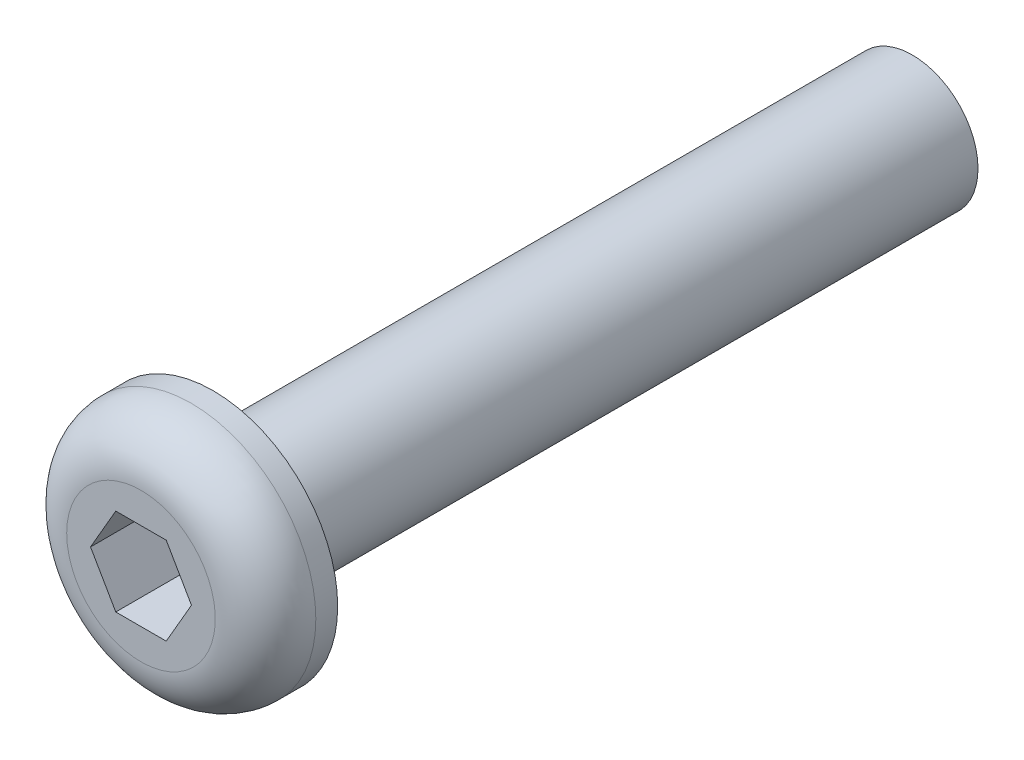
ISO-10303-21;
HEADER;
FILE_DESCRIPTION(('STEP AP214'),'2;1');
FILE_NAME('part.step','',(''),(''),'','','');
FILE_SCHEMA(('AUTOMOTIVE_DESIGN { 1 0 10303 214 1 1 1 1 }'));
ENDSEC;
DATA;
#1=APPLICATION_CONTEXT('core data for automotive mechanical design processes');
#2=APPLICATION_PROTOCOL_DEFINITION('international standard','automotive_design',2000,#1);
#3=PRODUCT_CONTEXT('',#1,'mechanical');
#4=PRODUCT('Part','Part','',(#3));
#5=PRODUCT_RELATED_PRODUCT_CATEGORY('part','',(#4));
#6=PRODUCT_DEFINITION_FORMATION('','',#4);
#7=PRODUCT_DEFINITION_CONTEXT('part definition',#1,'design');
#8=PRODUCT_DEFINITION('design','',#6,#7);
#9=PRODUCT_DEFINITION_SHAPE('','',#8);
#10=(LENGTH_UNIT() NAMED_UNIT(*) SI_UNIT(.MILLI.,.METRE.));
#11=(NAMED_UNIT(*) PLANE_ANGLE_UNIT() SI_UNIT($,.RADIAN.));
#12=(NAMED_UNIT(*) SI_UNIT($,.STERADIAN.) SOLID_ANGLE_UNIT());
#13=UNCERTAINTY_MEASURE_WITH_UNIT(LENGTH_MEASURE(1.E-05),#10,'distance_accuracy_value','');
#14=(GEOMETRIC_REPRESENTATION_CONTEXT(3) GLOBAL_UNCERTAINTY_ASSIGNED_CONTEXT((#13)) GLOBAL_UNIT_ASSIGNED_CONTEXT((#10,
#11,#12)) REPRESENTATION_CONTEXT('',''));
#15=CARTESIAN_POINT('',(0.,0.,0.));
#16=DIRECTION('',(0.,0.,1.));
#17=DIRECTION('',(1.,0.,0.));
#18=AXIS2_PLACEMENT_3D('',#15,#16,#17);
#19=CARTESIAN_POINT('',(0.,0.,-16.));
#20=DIRECTION('',(0.,0.,1.));
#21=DIRECTION('',(1.,0.,0.));
#22=AXIS2_PLACEMENT_3D('',#19,#20,#21);
#23=CYLINDRICAL_SURFACE('',#22,1.5);
#24=CARTESIAN_POINT('',(0.,0.,-16.));
#25=DIRECTION('',(0.,0.,1.));
#26=DIRECTION('',(1.,0.,0.));
#27=AXIS2_PLACEMENT_3D('',#24,#25,#26);
#28=CIRCLE('',#27,1.5);
#29=CARTESIAN_POINT('',(1.5,0.,-16.));
#30=VERTEX_POINT('',#29);
#31=EDGE_CURVE('E11',#30,#30,#28,.T.);
#32=ORIENTED_EDGE('',*,*,#31,.T.);
#33=EDGE_LOOP('',(#32));
#34=FACE_BOUND('',#33,.T.);
#35=CARTESIAN_POINT('',(0.,0.,0.));
#36=DIRECTION('',(0.,0.,1.));
#37=DIRECTION('',(1.,0.,0.));
#38=AXIS2_PLACEMENT_3D('',#35,#36,#37);
#39=CIRCLE('',#38,1.5);
#40=CARTESIAN_POINT('',(1.5,0.,0.));
#41=VERTEX_POINT('',#40);
#42=EDGE_CURVE('E41',#41,#41,#39,.T.);
#43=ORIENTED_EDGE('',*,*,#42,.F.);
#44=EDGE_LOOP('',(#43));
#45=FACE_BOUND('',#44,.T.);
#46=ADVANCED_FACE('F38',(#34,#45),#23,.T.);
#47=CARTESIAN_POINT('',(0.,0.,-16.));
#48=DIRECTION('',(0.,0.,1.));
#49=DIRECTION('',(1.,0.,0.));
#50=AXIS2_PLACEMENT_3D('',#47,#48,#49);
#51=PLANE('',#50);
#52=ORIENTED_EDGE('',*,*,#31,.F.);
#53=EDGE_LOOP('',(#52));
#54=FACE_BOUND('',#53,.T.);
#55=ADVANCED_FACE('F161',(#54),#51,.F.);
#56=CARTESIAN_POINT('',(0.,0.,1.65));
#57=DIRECTION('',(0.,0.,1.));
#58=DIRECTION('',(1.,0.,0.));
#59=AXIS2_PLACEMENT_3D('',#56,#57,#58);
#60=PLANE('',#59);
#61=DIRECTION('',(-1.,0.,0.));
#62=VECTOR('',#61,1.);
#63=CARTESIAN_POINT('',(0.577350269189626,1.,1.65));
#64=LINE('',#63,#62);
#65=CARTESIAN_POINT('',(0.577350269189626,1.,1.65));
#66=VERTEX_POINT('',#65);
#67=CARTESIAN_POINT('',(-0.577350269189626,1.,1.65));
#68=VERTEX_POINT('',#67);
#69=EDGE_CURVE('E52',#66,#68,#64,.T.);
#70=ORIENTED_EDGE('',*,*,#69,.F.);
#71=DIRECTION('',(-0.5,0.866025403784439,0.));
#72=VECTOR('',#71,1.);
#73=CARTESIAN_POINT('',(1.15470053837925,0.,1.65));
#74=LINE('',#73,#72);
#75=CARTESIAN_POINT('',(1.15470053837925,0.,1.65));
#76=VERTEX_POINT('',#75);
#77=EDGE_CURVE('E135',#76,#66,#74,.T.);
#78=ORIENTED_EDGE('',*,*,#77,.F.);
#79=DIRECTION('',(0.5,0.866025403784439,0.));
#80=VECTOR('',#79,1.);
#81=CARTESIAN_POINT('',(0.577350269189626,-0.999999999999999,1.65));
#82=LINE('',#81,#80);
#83=CARTESIAN_POINT('',(0.577350269189626,-0.999999999999999,1.65));
#84=VERTEX_POINT('',#83);
#85=EDGE_CURVE('E133',#84,#76,#82,.T.);
#86=ORIENTED_EDGE('',*,*,#85,.F.);
#87=DIRECTION('',(1.,0.,0.));
#88=VECTOR('',#87,1.);
#89=CARTESIAN_POINT('',(-0.577350269189626,-1.,1.65));
#90=LINE('',#89,#88);
#91=CARTESIAN_POINT('',(-0.577350269189626,-1.,1.65));
#92=VERTEX_POINT('',#91);
#93=EDGE_CURVE('E100',#92,#84,#90,.T.);
#94=ORIENTED_EDGE('',*,*,#93,.F.);
#95=DIRECTION('',(0.5,-0.866025403784439,0.));
#96=VECTOR('',#95,1.);
#97=CARTESIAN_POINT('',(-1.15470053837925,0.,1.65));
#98=LINE('',#97,#96);
#99=CARTESIAN_POINT('',(-1.15470053837925,0.,1.65));
#100=VERTEX_POINT('',#99);
#101=EDGE_CURVE('E129',#100,#92,#98,.T.);
#102=ORIENTED_EDGE('',*,*,#101,.F.);
#103=DIRECTION('',(-0.5,-0.866025403784438,0.));
#104=VECTOR('',#103,1.);
#105=CARTESIAN_POINT('',(-0.577350269189626,1.,1.65));
#106=LINE('',#105,#104);
#107=EDGE_CURVE('E126',#68,#100,#106,.T.);
#108=ORIENTED_EDGE('',*,*,#107,.F.);
#109=EDGE_LOOP('',(#70,#78,#86,#94,#102,#108));
#110=FACE_BOUND('',#109,.T.);
#111=CARTESIAN_POINT('',(0.,0.,1.65));
#112=DIRECTION('',(0.,0.,-1.));
#113=DIRECTION('',(-1.,0.,0.));
#114=AXIS2_PLACEMENT_3D('',#111,#112,#113);
#115=CIRCLE('',#114,1.7);
#116=CARTESIAN_POINT('',(-1.7,0.,1.65));
#117=VERTEX_POINT('',#116);
#118=EDGE_CURVE('E150',#117,#117,#115,.T.);
#119=ORIENTED_EDGE('',*,*,#118,.F.);
#120=EDGE_LOOP('',(#119));
#121=FACE_BOUND('',#120,.T.);
#122=ADVANCED_FACE('F166',(#110,#121),#60,.T.);
#123=CARTESIAN_POINT('',(0.,0.,0.5));
#124=DIRECTION('',(0.,0.,-1.));
#125=DIRECTION('',(-1.,0.,0.));
#126=AXIS2_PLACEMENT_3D('',#123,#124,#125);
#127=TOROIDAL_SURFACE('',#126,1.7,1.15);
#128=ORIENTED_EDGE('',*,*,#118,.T.);
#129=EDGE_LOOP('',(#128));
#130=FACE_BOUND('',#129,.T.);
#131=CARTESIAN_POINT('',(0.,0.,0.5));
#132=DIRECTION('',(0.,0.,-1.));
#133=DIRECTION('',(-1.,0.,0.));
#134=AXIS2_PLACEMENT_3D('',#131,#132,#133);
#135=CIRCLE('',#134,2.85);
#136=CARTESIAN_POINT('',(-2.85,0.,0.5));
#137=VERTEX_POINT('',#136);
#138=EDGE_CURVE('E147',#137,#137,#135,.T.);
#139=ORIENTED_EDGE('',*,*,#138,.F.);
#140=EDGE_LOOP('',(#139));
#141=FACE_BOUND('',#140,.T.);
#142=ADVANCED_FACE('F172',(#130,#141),#127,.T.);
#143=CARTESIAN_POINT('',(0.,0.,0.));
#144=DIRECTION('',(0.,0.,-1.));
#145=DIRECTION('',(-1.,0.,0.));
#146=AXIS2_PLACEMENT_3D('',#143,#144,#145);
#147=CYLINDRICAL_SURFACE('',#146,2.85);
#148=ORIENTED_EDGE('',*,*,#138,.T.);
#149=EDGE_LOOP('',(#148));
#150=FACE_BOUND('',#149,.T.);
#151=CARTESIAN_POINT('',(0.,0.,0.));
#152=DIRECTION('',(0.,0.,-1.));
#153=DIRECTION('',(-1.,0.,0.));
#154=AXIS2_PLACEMENT_3D('',#151,#152,#153);
#155=CIRCLE('',#154,2.85);
#156=CARTESIAN_POINT('',(-2.85,0.,0.));
#157=VERTEX_POINT('',#156);
#158=EDGE_CURVE('E139',#157,#157,#155,.T.);
#159=ORIENTED_EDGE('',*,*,#158,.F.);
#160=EDGE_LOOP('',(#159));
#161=FACE_BOUND('',#160,.T.);
#162=ADVANCED_FACE('F178',(#150,#161),#147,.T.);
#163=CARTESIAN_POINT('',(0.,0.,0.));
#164=DIRECTION('',(0.,0.,-1.));
#165=DIRECTION('',(-1.,0.,0.));
#166=AXIS2_PLACEMENT_3D('',#163,#164,#165);
#167=PLANE('',#166);
#168=ORIENTED_EDGE('',*,*,#42,.T.);
#169=EDGE_LOOP('',(#168));
#170=FACE_BOUND('',#169,.T.);
#171=ORIENTED_EDGE('',*,*,#158,.T.);
#172=EDGE_LOOP('',(#171));
#173=FACE_BOUND('',#172,.T.);
#174=ADVANCED_FACE('F157',(#170,#173),#167,.T.);
#175=CARTESIAN_POINT('',(0.577350269189626,1.,-0.35));
#176=DIRECTION('',(0.,1.,0.));
#177=DIRECTION('',(0.,0.,1.));
#178=AXIS2_PLACEMENT_3D('',#175,#176,#177);
#179=PLANE('',#178);
#180=ORIENTED_EDGE('',*,*,#69,.T.);
#181=DIRECTION('',(0.,0.,1.));
#182=VECTOR('',#181,1.);
#183=CARTESIAN_POINT('',(-0.577350269189626,1.,-0.35));
#184=LINE('',#183,#182);
#185=CARTESIAN_POINT('',(-0.577350269189626,1.,-0.35));
#186=VERTEX_POINT('',#185);
#187=EDGE_CURVE('E82',#186,#68,#184,.T.);
#188=ORIENTED_EDGE('',*,*,#187,.F.);
#189=DIRECTION('',(-1.,0.,0.));
#190=VECTOR('',#189,1.);
#191=CARTESIAN_POINT('',(0.577350269189626,1.,-0.35));
#192=LINE('',#191,#190);
#193=CARTESIAN_POINT('',(0.577350269189626,1.,-0.35));
#194=VERTEX_POINT('',#193);
#195=EDGE_CURVE('E137',#194,#186,#192,.T.);
#196=ORIENTED_EDGE('',*,*,#195,.F.);
#197=DIRECTION('',(0.,0.,1.));
#198=VECTOR('',#197,1.);
#199=CARTESIAN_POINT('',(0.577350269189626,1.,-0.35));
#200=LINE('',#199,#198);
#201=EDGE_CURVE('E60',#194,#66,#200,.T.);
#202=ORIENTED_EDGE('',*,*,#201,.T.);
#203=EDGE_LOOP('',(#180,#188,#196,#202));
#204=FACE_BOUND('',#203,.T.);
#205=ADVANCED_FACE('F184',(#204),#179,.F.);
#206=CARTESIAN_POINT('',(1.15470053837925,0.,-0.35));
#207=DIRECTION('',(0.866025403784439,0.5,0.));
#208=DIRECTION('',(-0.5,0.866025403784439,0.));
#209=AXIS2_PLACEMENT_3D('',#206,#207,#208);
#210=PLANE('',#209);
#211=ORIENTED_EDGE('',*,*,#77,.T.);
#212=ORIENTED_EDGE('',*,*,#201,.F.);
#213=DIRECTION('',(-0.5,0.866025403784439,0.));
#214=VECTOR('',#213,1.);
#215=CARTESIAN_POINT('',(1.15470053837925,0.,-0.35));
#216=LINE('',#215,#214);
#217=CARTESIAN_POINT('',(1.15470053837925,0.,-0.35));
#218=VERTEX_POINT('',#217);
#219=EDGE_CURVE('E112',#218,#194,#216,.T.);
#220=ORIENTED_EDGE('',*,*,#219,.F.);
#221=DIRECTION('',(0.,0.,1.));
#222=VECTOR('',#221,1.);
#223=CARTESIAN_POINT('',(1.15470053837925,0.,-0.35));
#224=LINE('',#223,#222);
#225=EDGE_CURVE('E104',#218,#76,#224,.T.);
#226=ORIENTED_EDGE('',*,*,#225,.T.);
#227=EDGE_LOOP('',(#211,#212,#220,#226));
#228=FACE_BOUND('',#227,.T.);
#229=ADVANCED_FACE('F187',(#228),#210,.F.);
#230=CARTESIAN_POINT('',(0.577350269189626,-0.999999999999999,-0.35));
#231=DIRECTION('',(0.866025403784439,-0.5,0.));
#232=DIRECTION('',(0.5,0.866025403784439,0.));
#233=AXIS2_PLACEMENT_3D('',#230,#231,#232);
#234=PLANE('',#233);
#235=ORIENTED_EDGE('',*,*,#85,.T.);
#236=ORIENTED_EDGE('',*,*,#225,.F.);
#237=DIRECTION('',(0.5,0.866025403784439,0.));
#238=VECTOR('',#237,1.);
#239=CARTESIAN_POINT('',(0.577350269189626,-0.999999999999999,-0.35));
#240=LINE('',#239,#238);
#241=CARTESIAN_POINT('',(0.577350269189626,-0.999999999999999,-0.35));
#242=VERTEX_POINT('',#241);
#243=EDGE_CURVE('E108',#242,#218,#240,.T.);
#244=ORIENTED_EDGE('',*,*,#243,.F.);
#245=DIRECTION('',(0.,0.,1.));
#246=VECTOR('',#245,1.);
#247=CARTESIAN_POINT('',(0.577350269189626,-0.999999999999999,-0.35));
#248=LINE('',#247,#246);
#249=EDGE_CURVE('E93',#242,#84,#248,.T.);
#250=ORIENTED_EDGE('',*,*,#249,.T.);
#251=EDGE_LOOP('',(#235,#236,#244,#250));
#252=FACE_BOUND('',#251,.T.);
#253=ADVANCED_FACE('F109',(#252),#234,.F.);
#254=CARTESIAN_POINT('',(-0.577350269189626,-1.,-0.35));
#255=DIRECTION('',(0.,-1.,0.));
#256=DIRECTION('',(1.,0.,0.));
#257=AXIS2_PLACEMENT_3D('',#254,#255,#256);
#258=PLANE('',#257);
#259=ORIENTED_EDGE('',*,*,#93,.T.);
#260=ORIENTED_EDGE('',*,*,#249,.F.);
#261=DIRECTION('',(1.,0.,0.));
#262=VECTOR('',#261,1.);
#263=CARTESIAN_POINT('',(-0.577350269189626,-1.,-0.35));
#264=LINE('',#263,#262);
#265=CARTESIAN_POINT('',(-0.577350269189626,-1.,-0.35));
#266=VERTEX_POINT('',#265);
#267=EDGE_CURVE('E97',#266,#242,#264,.T.);
#268=ORIENTED_EDGE('',*,*,#267,.F.);
#269=DIRECTION('',(0.,0.,1.));
#270=VECTOR('',#269,1.);
#271=CARTESIAN_POINT('',(-0.577350269189626,-1.,-0.35));
#272=LINE('',#271,#270);
#273=EDGE_CURVE('E105',#266,#92,#272,.T.);
#274=ORIENTED_EDGE('',*,*,#273,.T.);
#275=EDGE_LOOP('',(#259,#260,#268,#274));
#276=FACE_BOUND('',#275,.T.);
#277=ADVANCED_FACE('F95',(#276),#258,.F.);
#278=CARTESIAN_POINT('',(-1.15470053837925,0.,-0.35));
#279=DIRECTION('',(-0.866025403784439,-0.5,0.));
#280=DIRECTION('',(0.5,-0.866025403784439,0.));
#281=AXIS2_PLACEMENT_3D('',#278,#279,#280);
#282=PLANE('',#281);
#283=ORIENTED_EDGE('',*,*,#101,.T.);
#284=ORIENTED_EDGE('',*,*,#273,.F.);
#285=DIRECTION('',(0.5,-0.866025403784439,0.));
#286=VECTOR('',#285,1.);
#287=CARTESIAN_POINT('',(-1.15470053837925,0.,-0.35));
#288=LINE('',#287,#286);
#289=CARTESIAN_POINT('',(-1.15470053837925,0.,-0.35));
#290=VERTEX_POINT('',#289);
#291=EDGE_CURVE('E118',#290,#266,#288,.T.);
#292=ORIENTED_EDGE('',*,*,#291,.F.);
#293=DIRECTION('',(0.,0.,1.));
#294=VECTOR('',#293,1.);
#295=CARTESIAN_POINT('',(-1.15470053837925,0.,-0.35));
#296=LINE('',#295,#294);
#297=EDGE_CURVE('E142',#290,#100,#296,.T.);
#298=ORIENTED_EDGE('',*,*,#297,.T.);
#299=EDGE_LOOP('',(#283,#284,#292,#298));
#300=FACE_BOUND('',#299,.T.);
#301=ADVANCED_FACE('F191',(#300),#282,.F.);
#302=CARTESIAN_POINT('',(-0.577350269189626,1.,-0.35));
#303=DIRECTION('',(-0.866025403784439,0.5,0.));
#304=DIRECTION('',(-0.5,-0.866025403784438,0.));
#305=AXIS2_PLACEMENT_3D('',#302,#303,#304);
#306=PLANE('',#305);
#307=ORIENTED_EDGE('',*,*,#107,.T.);
#308=ORIENTED_EDGE('',*,*,#297,.F.);
#309=DIRECTION('',(-0.5,-0.866025403784438,0.));
#310=VECTOR('',#309,1.);
#311=CARTESIAN_POINT('',(-0.577350269189626,1.,-0.35));
#312=LINE('',#311,#310);
#313=EDGE_CURVE('E120',#186,#290,#312,.T.);
#314=ORIENTED_EDGE('',*,*,#313,.F.);
#315=ORIENTED_EDGE('',*,*,#187,.T.);
#316=EDGE_LOOP('',(#307,#308,#314,#315));
#317=FACE_BOUND('',#316,.T.);
#318=ADVANCED_FACE('F188',(#317),#306,.F.);
#319=CARTESIAN_POINT('',(-1.73205080756888,1.,-0.35));
#320=DIRECTION('',(0.,0.,1.));
#321=DIRECTION('',(1.,0.,0.));
#322=AXIS2_PLACEMENT_3D('',#319,#320,#321);
#323=PLANE('',#322);
#324=ORIENTED_EDGE('',*,*,#195,.T.);
#325=ORIENTED_EDGE('',*,*,#313,.T.);
#326=ORIENTED_EDGE('',*,*,#291,.T.);
#327=ORIENTED_EDGE('',*,*,#267,.T.);
#328=ORIENTED_EDGE('',*,*,#243,.T.);
#329=ORIENTED_EDGE('',*,*,#219,.T.);
#330=EDGE_LOOP('',(#324,#325,#326,#327,#328,#329));
#331=FACE_BOUND('',#330,.T.);
#332=ADVANCED_FACE('F115',(#331),#323,.T.);
#333=CLOSED_SHELL('',(#46,#55,#122,#142,#162,#174,#205,#229,#253,#277,#301,#318,#332));
#334=MANIFOLD_SOLID_BREP('B2',#333);
#335=ADVANCED_BREP_SHAPE_REPRESENTATION('',(#18,#334),#14);
#336=SHAPE_DEFINITION_REPRESENTATION(#9,#335);
ENDSEC;
END-ISO-10303-21;
